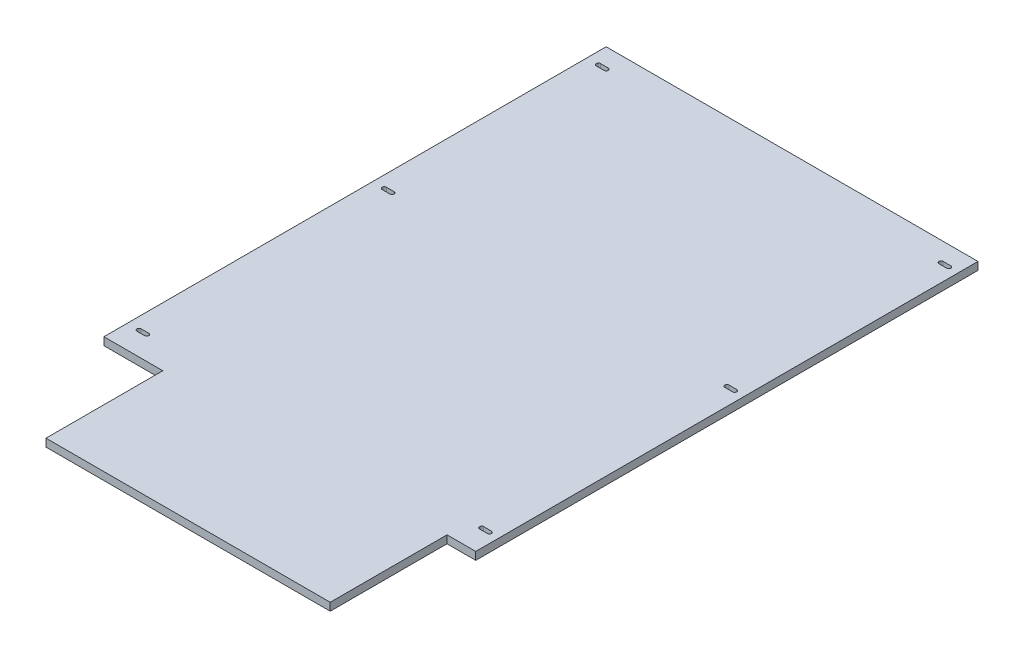
ISO-10303-21;
HEADER;
FILE_DESCRIPTION(('STEP AP214'),'2;1');
FILE_NAME('part.step','',(''),(''),'','','');
FILE_SCHEMA(('AUTOMOTIVE_DESIGN { 1 0 10303 214 1 1 1 1 }'));
ENDSEC;
DATA;
#1=APPLICATION_CONTEXT('core data for automotive mechanical design processes');
#2=APPLICATION_PROTOCOL_DEFINITION('international standard','automotive_design',2000,#1);
#3=PRODUCT_CONTEXT('',#1,'mechanical');
#4=PRODUCT('Part','Part','',(#3));
#5=PRODUCT_RELATED_PRODUCT_CATEGORY('part','',(#4));
#6=PRODUCT_DEFINITION_FORMATION('','',#4);
#7=PRODUCT_DEFINITION_CONTEXT('part definition',#1,'design');
#8=PRODUCT_DEFINITION('design','',#6,#7);
#9=PRODUCT_DEFINITION_SHAPE('','',#8);
#10=(LENGTH_UNIT() NAMED_UNIT(*) SI_UNIT(.MILLI.,.METRE.));
#11=(NAMED_UNIT(*) PLANE_ANGLE_UNIT() SI_UNIT($,.RADIAN.));
#12=(NAMED_UNIT(*) SI_UNIT($,.STERADIAN.) SOLID_ANGLE_UNIT());
#13=UNCERTAINTY_MEASURE_WITH_UNIT(LENGTH_MEASURE(1.E-05),#10,'distance_accuracy_value','');
#14=(GEOMETRIC_REPRESENTATION_CONTEXT(3) GLOBAL_UNCERTAINTY_ASSIGNED_CONTEXT((#13)) GLOBAL_UNIT_ASSIGNED_CONTEXT((#10,
#11,#12)) REPRESENTATION_CONTEXT('',''));
#15=CARTESIAN_POINT('',(0.,0.,0.));
#16=DIRECTION('',(0.,0.,1.));
#17=DIRECTION('',(1.,0.,0.));
#18=AXIS2_PLACEMENT_3D('',#15,#16,#17);
#19=CARTESIAN_POINT('',(0.,12.7,0.));
#20=DIRECTION('',(0.,1.,0.));
#21=DIRECTION('',(0.,0.,1.));
#22=AXIS2_PLACEMENT_3D('',#19,#20,#21);
#23=PLANE('',#22);
#24=DIRECTION('',(0.,0.,1.));
#25=VECTOR('',#24,1.);
#26=CARTESIAN_POINT('',(0.,12.7,-819.15));
#27=LINE('',#26,#25);
#28=CARTESIAN_POINT('',(0.,12.7,-819.15));
#29=VERTEX_POINT('',#28);
#30=CARTESIAN_POINT('',(0.,12.7,0.));
#31=VERTEX_POINT('',#30);
#32=EDGE_CURVE('E433',#29,#31,#27,.T.);
#33=ORIENTED_EDGE('',*,*,#32,.T.);
#34=DIRECTION('',(1.,0.,0.));
#35=VECTOR('',#34,1.);
#36=CARTESIAN_POINT('',(0.,12.7,0.));
#37=LINE('',#36,#35);
#38=CARTESIAN_POINT('',(96.04375,12.7,0.));
#39=VERTEX_POINT('',#38);
#40=EDGE_CURVE('E436',#31,#39,#37,.T.);
#41=ORIENTED_EDGE('',*,*,#40,.T.);
#42=DIRECTION('',(0.,0.,1.));
#43=VECTOR('',#42,1.);
#44=CARTESIAN_POINT('',(96.04375,12.7,0.));
#45=LINE('',#44,#43);
#46=CARTESIAN_POINT('',(96.04375,12.7,190.5));
#47=VERTEX_POINT('',#46);
#48=EDGE_CURVE('E439',#39,#47,#45,.T.);
#49=ORIENTED_EDGE('',*,*,#48,.T.);
#50=DIRECTION('',(1.,0.,0.));
#51=VECTOR('',#50,1.);
#52=CARTESIAN_POINT('',(96.04375,12.7,190.5));
#53=LINE('',#52,#51);
#54=CARTESIAN_POINT('',(559.59375,12.7,190.5));
#55=VERTEX_POINT('',#54);
#56=EDGE_CURVE('E441',#47,#55,#53,.T.);
#57=ORIENTED_EDGE('',*,*,#56,.T.);
#58=DIRECTION('',(0.,0.,-1.));
#59=VECTOR('',#58,1.);
#60=CARTESIAN_POINT('',(559.59375,12.7,190.5));
#61=LINE('',#60,#59);
#62=CARTESIAN_POINT('',(559.59375,12.7,0.));
#63=VERTEX_POINT('',#62);
#64=EDGE_CURVE('E443',#55,#63,#61,.T.);
#65=ORIENTED_EDGE('',*,*,#64,.T.);
#66=DIRECTION('',(1.,0.,0.));
#67=VECTOR('',#66,1.);
#68=CARTESIAN_POINT('',(559.59375,12.7,0.));
#69=LINE('',#68,#67);
#70=CARTESIAN_POINT('',(606.425,12.7,0.));
#71=VERTEX_POINT('',#70);
#72=EDGE_CURVE('E445',#63,#71,#69,.T.);
#73=ORIENTED_EDGE('',*,*,#72,.T.);
#74=DIRECTION('',(0.,0.,-1.));
#75=VECTOR('',#74,1.);
#76=CARTESIAN_POINT('',(606.425,12.7,0.));
#77=LINE('',#76,#75);
#78=CARTESIAN_POINT('',(606.425,12.7,-819.15));
#79=VERTEX_POINT('',#78);
#80=EDGE_CURVE('E447',#71,#79,#77,.T.);
#81=ORIENTED_EDGE('',*,*,#80,.T.);
#82=DIRECTION('',(-1.,0.,0.));
#83=VECTOR('',#82,1.);
#84=CARTESIAN_POINT('',(606.425,12.7,-819.15));
#85=LINE('',#84,#83);
#86=EDGE_CURVE('E449',#79,#29,#85,.T.);
#87=ORIENTED_EDGE('',*,*,#86,.T.);
#88=EDGE_LOOP('',(#33,#41,#49,#57,#65,#73,#81,#87));
#89=FACE_BOUND('',#88,.T.);
#90=DIRECTION('',(1.,0.,0.));
#91=VECTOR('',#90,1.);
#92=CARTESIAN_POINT('',(19.0500000000001,12.7,-34.7218));
#93=LINE('',#92,#91);
#94=CARTESIAN_POINT('',(19.0500000000001,12.7,-34.7218));
#95=VERTEX_POINT('',#94);
#96=CARTESIAN_POINT('',(31.7500000000001,12.7,-34.7218));
#97=VERTEX_POINT('',#96);
#98=EDGE_CURVE('E404',#95,#97,#93,.T.);
#99=ORIENTED_EDGE('',*,*,#98,.F.);
#100=CARTESIAN_POINT('',(19.0500000000001,12.7,-38.1));
#101=DIRECTION('',(0.,1.,0.));
#102=DIRECTION('',(0.,0.,1.));
#103=AXIS2_PLACEMENT_3D('',#100,#101,#102);
#104=CIRCLE('',#103,3.37819999999999);
#105=CARTESIAN_POINT('',(19.0500000000001,12.7,-41.4782));
#106=VERTEX_POINT('',#105);
#107=EDGE_CURVE('E402',#106,#95,#104,.T.);
#108=ORIENTED_EDGE('',*,*,#107,.F.);
#109=DIRECTION('',(-1.,0.,0.));
#110=VECTOR('',#109,1.);
#111=CARTESIAN_POINT('',(19.0500000000001,12.7,-41.4782));
#112=LINE('',#111,#110);
#113=CARTESIAN_POINT('',(31.7500000000001,12.7,-41.4782));
#114=VERTEX_POINT('',#113);
#115=EDGE_CURVE('E410',#114,#106,#112,.T.);
#116=ORIENTED_EDGE('',*,*,#115,.F.);
#117=CARTESIAN_POINT('',(31.7500000000001,12.7,-38.1));
#118=DIRECTION('',(0.,1.,0.));
#119=DIRECTION('',(0.,0.,1.));
#120=AXIS2_PLACEMENT_3D('',#117,#118,#119);
#121=CIRCLE('',#120,3.37819999999999);
#122=EDGE_CURVE('E407',#97,#114,#121,.T.);
#123=ORIENTED_EDGE('',*,*,#122,.F.);
#124=EDGE_LOOP('',(#99,#108,#116,#123));
#125=FACE_BOUND('',#124,.T.);
#126=DIRECTION('',(1.,0.,0.));
#127=VECTOR('',#126,1.);
#128=CARTESIAN_POINT('',(19.0500000000001,12.7,-434.7718));
#129=LINE('',#128,#127);
#130=CARTESIAN_POINT('',(19.0500000000001,12.7,-434.7718));
#131=VERTEX_POINT('',#130);
#132=CARTESIAN_POINT('',(31.7500000000001,12.7,-434.7718));
#133=VERTEX_POINT('',#132);
#134=EDGE_CURVE('E373',#131,#133,#129,.T.);
#135=ORIENTED_EDGE('',*,*,#134,.F.);
#136=CARTESIAN_POINT('',(19.0500000000001,12.7,-438.15));
#137=DIRECTION('',(0.,1.,0.));
#138=DIRECTION('',(0.,0.,1.));
#139=AXIS2_PLACEMENT_3D('',#136,#137,#138);
#140=CIRCLE('',#139,3.37820000000016);
#141=CARTESIAN_POINT('',(19.0500000000001,12.7,-441.5282));
#142=VERTEX_POINT('',#141);
#143=EDGE_CURVE('E371',#142,#131,#140,.T.);
#144=ORIENTED_EDGE('',*,*,#143,.F.);
#145=DIRECTION('',(-1.,0.,0.));
#146=VECTOR('',#145,1.);
#147=CARTESIAN_POINT('',(19.0500000000001,12.7,-441.5282));
#148=LINE('',#147,#146);
#149=CARTESIAN_POINT('',(31.7500000000001,12.7,-441.5282));
#150=VERTEX_POINT('',#149);
#151=EDGE_CURVE('E379',#150,#142,#148,.T.);
#152=ORIENTED_EDGE('',*,*,#151,.F.);
#153=CARTESIAN_POINT('',(31.7500000000001,12.7,-438.15));
#154=DIRECTION('',(0.,1.,0.));
#155=DIRECTION('',(0.,0.,1.));
#156=AXIS2_PLACEMENT_3D('',#153,#154,#155);
#157=CIRCLE('',#156,3.37820000000016);
#158=EDGE_CURVE('E376',#133,#150,#157,.T.);
#159=ORIENTED_EDGE('',*,*,#158,.F.);
#160=EDGE_LOOP('',(#135,#144,#152,#159));
#161=FACE_BOUND('',#160,.T.);
#162=DIRECTION('',(-1.,0.,0.));
#163=VECTOR('',#162,1.);
#164=CARTESIAN_POINT('',(31.7500000000001,12.7,-790.7782));
#165=LINE('',#164,#163);
#166=CARTESIAN_POINT('',(31.7500000000001,12.7,-790.7782));
#167=VERTEX_POINT('',#166);
#168=CARTESIAN_POINT('',(19.0500000000001,12.7,-790.7782));
#169=VERTEX_POINT('',#168);
#170=EDGE_CURVE('E342',#167,#169,#165,.T.);
#171=ORIENTED_EDGE('',*,*,#170,.F.);
#172=CARTESIAN_POINT('',(31.7500000000001,12.7,-787.4));
#173=DIRECTION('',(0.,1.,0.));
#174=DIRECTION('',(0.,0.,1.));
#175=AXIS2_PLACEMENT_3D('',#172,#173,#174);
#176=CIRCLE('',#175,3.3782);
#177=CARTESIAN_POINT('',(31.75,12.7,-784.0218));
#178=VERTEX_POINT('',#177);
#179=EDGE_CURVE('E340',#178,#167,#176,.T.);
#180=ORIENTED_EDGE('',*,*,#179,.F.);
#181=DIRECTION('',(1.,0.,0.));
#182=VECTOR('',#181,1.);
#183=CARTESIAN_POINT('',(31.75,12.7,-784.0218));
#184=LINE('',#183,#182);
#185=CARTESIAN_POINT('',(19.0500000000001,12.7,-784.0218));
#186=VERTEX_POINT('',#185);
#187=EDGE_CURVE('E348',#186,#178,#184,.T.);
#188=ORIENTED_EDGE('',*,*,#187,.F.);
#189=CARTESIAN_POINT('',(19.0500000000001,12.7,-787.4));
#190=DIRECTION('',(0.,1.,0.));
#191=DIRECTION('',(0.,0.,1.));
#192=AXIS2_PLACEMENT_3D('',#189,#190,#191);
#193=CIRCLE('',#192,3.3782);
#194=EDGE_CURVE('E345',#169,#186,#193,.T.);
#195=ORIENTED_EDGE('',*,*,#194,.F.);
#196=EDGE_LOOP('',(#171,#180,#188,#195));
#197=FACE_BOUND('',#196,.T.);
#198=DIRECTION('',(1.,0.,0.));
#199=VECTOR('',#198,1.);
#200=CARTESIAN_POINT('',(577.85,12.7,-784.0218));
#201=LINE('',#200,#199);
#202=CARTESIAN_POINT('',(577.85,12.7,-784.0218));
#203=VERTEX_POINT('',#202);
#204=CARTESIAN_POINT('',(590.55,12.7,-784.0218));
#205=VERTEX_POINT('',#204);
#206=EDGE_CURVE('E311',#203,#205,#201,.T.);
#207=ORIENTED_EDGE('',*,*,#206,.F.);
#208=CARTESIAN_POINT('',(577.85,12.7,-787.4));
#209=DIRECTION('',(0.,1.,0.));
#210=DIRECTION('',(0.,0.,-1.));
#211=AXIS2_PLACEMENT_3D('',#208,#209,#210);
#212=CIRCLE('',#211,3.3782);
#213=CARTESIAN_POINT('',(577.85,12.7,-790.7782));
#214=VERTEX_POINT('',#213);
#215=EDGE_CURVE('E309',#214,#203,#212,.T.);
#216=ORIENTED_EDGE('',*,*,#215,.F.);
#217=DIRECTION('',(-1.,0.,0.));
#218=VECTOR('',#217,1.);
#219=CARTESIAN_POINT('',(577.85,12.7,-790.7782));
#220=LINE('',#219,#218);
#221=CARTESIAN_POINT('',(590.55,12.7,-790.7782));
#222=VERTEX_POINT('',#221);
#223=EDGE_CURVE('E317',#222,#214,#220,.T.);
#224=ORIENTED_EDGE('',*,*,#223,.F.);
#225=CARTESIAN_POINT('',(590.55,12.7,-787.4));
#226=DIRECTION('',(0.,1.,0.));
#227=DIRECTION('',(0.,0.,-1.));
#228=AXIS2_PLACEMENT_3D('',#225,#226,#227);
#229=CIRCLE('',#228,3.3782);
#230=EDGE_CURVE('E314',#205,#222,#229,.T.);
#231=ORIENTED_EDGE('',*,*,#230,.F.);
#232=EDGE_LOOP('',(#207,#216,#224,#231));
#233=FACE_BOUND('',#232,.T.);
#234=DIRECTION('',(-1.,0.,0.));
#235=VECTOR('',#234,1.);
#236=CARTESIAN_POINT('',(590.55,12.7,-441.5282));
#237=LINE('',#236,#235);
#238=CARTESIAN_POINT('',(590.55,12.7,-441.5282));
#239=VERTEX_POINT('',#238);
#240=CARTESIAN_POINT('',(577.85,12.7,-441.5282));
#241=VERTEX_POINT('',#240);
#242=EDGE_CURVE('E280',#239,#241,#237,.T.);
#243=ORIENTED_EDGE('',*,*,#242,.F.);
#244=CARTESIAN_POINT('',(590.55,12.7,-438.15));
#245=DIRECTION('',(0.,1.,0.));
#246=DIRECTION('',(0.,0.,-1.));
#247=AXIS2_PLACEMENT_3D('',#244,#245,#246);
#248=CIRCLE('',#247,3.3782);
#249=CARTESIAN_POINT('',(590.55,12.7,-434.7718));
#250=VERTEX_POINT('',#249);
#251=EDGE_CURVE('E278',#250,#239,#248,.T.);
#252=ORIENTED_EDGE('',*,*,#251,.F.);
#253=DIRECTION('',(1.,0.,0.));
#254=VECTOR('',#253,1.);
#255=CARTESIAN_POINT('',(590.55,12.7,-434.7718));
#256=LINE('',#255,#254);
#257=CARTESIAN_POINT('',(577.85,12.7,-434.7718));
#258=VERTEX_POINT('',#257);
#259=EDGE_CURVE('E286',#258,#250,#256,.T.);
#260=ORIENTED_EDGE('',*,*,#259,.F.);
#261=CARTESIAN_POINT('',(577.85,12.7,-438.15));
#262=DIRECTION('',(0.,1.,0.));
#263=DIRECTION('',(0.,0.,-1.));
#264=AXIS2_PLACEMENT_3D('',#261,#262,#263);
#265=CIRCLE('',#264,3.3782);
#266=EDGE_CURVE('E283',#241,#258,#265,.T.);
#267=ORIENTED_EDGE('',*,*,#266,.F.);
#268=EDGE_LOOP('',(#243,#252,#260,#267));
#269=FACE_BOUND('',#268,.T.);
#270=DIRECTION('',(-1.,0.,0.));
#271=VECTOR('',#270,1.);
#272=CARTESIAN_POINT('',(590.55,12.7,-41.4782));
#273=LINE('',#272,#271);
#274=CARTESIAN_POINT('',(590.55,12.7,-41.4782));
#275=VERTEX_POINT('',#274);
#276=CARTESIAN_POINT('',(577.85,12.7,-41.4782));
#277=VERTEX_POINT('',#276);
#278=EDGE_CURVE('E250',#275,#277,#273,.T.);
#279=ORIENTED_EDGE('',*,*,#278,.F.);
#280=CARTESIAN_POINT('',(590.55,12.7,-38.1));
#281=DIRECTION('',(0.,1.,0.));
#282=DIRECTION('',(0.,0.,-1.));
#283=AXIS2_PLACEMENT_3D('',#280,#281,#282);
#284=CIRCLE('',#283,3.37820000000002);
#285=CARTESIAN_POINT('',(590.55,12.7,-34.7218));
#286=VERTEX_POINT('',#285);
#287=EDGE_CURVE('E242',#286,#275,#284,.T.);
#288=ORIENTED_EDGE('',*,*,#287,.F.);
#289=DIRECTION('',(1.,0.,0.));
#290=VECTOR('',#289,1.);
#291=CARTESIAN_POINT('',(590.55,12.7,-34.7218));
#292=LINE('',#291,#290);
#293=CARTESIAN_POINT('',(577.85,12.7,-34.7218));
#294=VERTEX_POINT('',#293);
#295=EDGE_CURVE('E264',#294,#286,#292,.T.);
#296=ORIENTED_EDGE('',*,*,#295,.F.);
#297=CARTESIAN_POINT('',(577.85,12.7,-38.1));
#298=DIRECTION('',(0.,1.,0.));
#299=DIRECTION('',(0.,0.,-1.));
#300=AXIS2_PLACEMENT_3D('',#297,#298,#299);
#301=CIRCLE('',#300,3.37820000000002);
#302=EDGE_CURVE('E262',#277,#294,#301,.T.);
#303=ORIENTED_EDGE('',*,*,#302,.F.);
#304=EDGE_LOOP('',(#279,#288,#296,#303));
#305=FACE_BOUND('',#304,.T.);
#306=ADVANCED_FACE('F33',(#89,#125,#161,#197,#233,#269,#305),#23,.T.);
#307=CARTESIAN_POINT('',(0.,0.,0.));
#308=DIRECTION('',(0.,1.,0.));
#309=DIRECTION('',(0.,0.,1.));
#310=AXIS2_PLACEMENT_3D('',#307,#308,#309);
#311=PLANE('',#310);
#312=CARTESIAN_POINT('',(590.55,0.,-438.15));
#313=DIRECTION('',(0.,1.,0.));
#314=DIRECTION('',(0.,0.,-1.));
#315=AXIS2_PLACEMENT_3D('',#312,#313,#314);
#316=CIRCLE('',#315,3.3782);
#317=CARTESIAN_POINT('',(590.55,0.,-434.7718));
#318=VERTEX_POINT('',#317);
#319=CARTESIAN_POINT('',(590.55,0.,-441.5282));
#320=VERTEX_POINT('',#319);
#321=EDGE_CURVE('E258',#318,#320,#316,.T.);
#322=ORIENTED_EDGE('',*,*,#321,.T.);
#323=DIRECTION('',(-1.,0.,0.));
#324=VECTOR('',#323,1.);
#325=CARTESIAN_POINT('',(590.55,0.,-441.5282));
#326=LINE('',#325,#324);
#327=CARTESIAN_POINT('',(577.85,0.,-441.5282));
#328=VERTEX_POINT('',#327);
#329=EDGE_CURVE('E291',#320,#328,#326,.T.);
#330=ORIENTED_EDGE('',*,*,#329,.T.);
#331=CARTESIAN_POINT('',(577.85,0.,-438.15));
#332=DIRECTION('',(0.,1.,0.));
#333=DIRECTION('',(0.,0.,-1.));
#334=AXIS2_PLACEMENT_3D('',#331,#332,#333);
#335=CIRCLE('',#334,3.3782);
#336=CARTESIAN_POINT('',(577.85,0.,-434.7718));
#337=VERTEX_POINT('',#336);
#338=EDGE_CURVE('E294',#328,#337,#335,.T.);
#339=ORIENTED_EDGE('',*,*,#338,.T.);
#340=DIRECTION('',(1.,0.,0.));
#341=VECTOR('',#340,1.);
#342=CARTESIAN_POINT('',(590.55,0.,-434.7718));
#343=LINE('',#342,#341);
#344=EDGE_CURVE('E281',#337,#318,#343,.T.);
#345=ORIENTED_EDGE('',*,*,#344,.T.);
#346=EDGE_LOOP('',(#322,#330,#339,#345));
#347=FACE_BOUND('',#346,.T.);
#348=CARTESIAN_POINT('',(31.7500000000001,0.,-787.4));
#349=DIRECTION('',(0.,1.,0.));
#350=DIRECTION('',(0.,0.,1.));
#351=AXIS2_PLACEMENT_3D('',#348,#349,#350);
#352=CIRCLE('',#351,3.3782);
#353=CARTESIAN_POINT('',(31.75,0.,-784.0218));
#354=VERTEX_POINT('',#353);
#355=CARTESIAN_POINT('',(31.7500000000001,0.,-790.7782));
#356=VERTEX_POINT('',#355);
#357=EDGE_CURVE('E339',#354,#356,#352,.T.);
#358=ORIENTED_EDGE('',*,*,#357,.T.);
#359=DIRECTION('',(-1.,0.,0.));
#360=VECTOR('',#359,1.);
#361=CARTESIAN_POINT('',(31.7500000000001,0.,-790.7782));
#362=LINE('',#361,#360);
#363=CARTESIAN_POINT('',(19.0500000000001,0.,-790.7782));
#364=VERTEX_POINT('',#363);
#365=EDGE_CURVE('E353',#356,#364,#362,.T.);
#366=ORIENTED_EDGE('',*,*,#365,.T.);
#367=CARTESIAN_POINT('',(19.0500000000001,0.,-787.4));
#368=DIRECTION('',(0.,1.,0.));
#369=DIRECTION('',(0.,0.,1.));
#370=AXIS2_PLACEMENT_3D('',#367,#368,#369);
#371=CIRCLE('',#370,3.3782);
#372=CARTESIAN_POINT('',(19.0500000000001,0.,-784.0218));
#373=VERTEX_POINT('',#372);
#374=EDGE_CURVE('E356',#364,#373,#371,.T.);
#375=ORIENTED_EDGE('',*,*,#374,.T.);
#376=DIRECTION('',(1.,0.,0.));
#377=VECTOR('',#376,1.);
#378=CARTESIAN_POINT('',(31.75,0.,-784.0218));
#379=LINE('',#378,#377);
#380=EDGE_CURVE('E343',#373,#354,#379,.T.);
#381=ORIENTED_EDGE('',*,*,#380,.T.);
#382=EDGE_LOOP('',(#358,#366,#375,#381));
#383=FACE_BOUND('',#382,.T.);
#384=CARTESIAN_POINT('',(19.0500000000001,0.,-38.1));
#385=DIRECTION('',(0.,1.,0.));
#386=DIRECTION('',(0.,0.,1.));
#387=AXIS2_PLACEMENT_3D('',#384,#385,#386);
#388=CIRCLE('',#387,3.37819999999999);
#389=CARTESIAN_POINT('',(19.0500000000001,0.,-41.4782));
#390=VERTEX_POINT('',#389);
#391=CARTESIAN_POINT('',(19.0500000000001,0.,-34.7218));
#392=VERTEX_POINT('',#391);
#393=EDGE_CURVE('E401',#390,#392,#388,.T.);
#394=ORIENTED_EDGE('',*,*,#393,.T.);
#395=DIRECTION('',(1.,0.,0.));
#396=VECTOR('',#395,1.);
#397=CARTESIAN_POINT('',(19.0500000000001,0.,-34.7218));
#398=LINE('',#397,#396);
#399=CARTESIAN_POINT('',(31.7500000000001,0.,-34.7218));
#400=VERTEX_POINT('',#399);
#401=EDGE_CURVE('E415',#392,#400,#398,.T.);
#402=ORIENTED_EDGE('',*,*,#401,.T.);
#403=CARTESIAN_POINT('',(31.7500000000001,0.,-38.1));
#404=DIRECTION('',(0.,1.,0.));
#405=DIRECTION('',(0.,0.,1.));
#406=AXIS2_PLACEMENT_3D('',#403,#404,#405);
#407=CIRCLE('',#406,3.37819999999999);
#408=CARTESIAN_POINT('',(31.7500000000001,0.,-41.4782));
#409=VERTEX_POINT('',#408);
#410=EDGE_CURVE('E418',#400,#409,#407,.T.);
#411=ORIENTED_EDGE('',*,*,#410,.T.);
#412=DIRECTION('',(-1.,0.,0.));
#413=VECTOR('',#412,1.);
#414=CARTESIAN_POINT('',(19.0500000000001,0.,-41.4782));
#415=LINE('',#414,#413);
#416=EDGE_CURVE('E405',#409,#390,#415,.T.);
#417=ORIENTED_EDGE('',*,*,#416,.T.);
#418=EDGE_LOOP('',(#394,#402,#411,#417));
#419=FACE_BOUND('',#418,.T.);
#420=DIRECTION('',(0.,0.,1.));
#421=VECTOR('',#420,1.);
#422=CARTESIAN_POINT('',(0.,0.,-819.15));
#423=LINE('',#422,#421);
#424=CARTESIAN_POINT('',(0.,0.,-819.15));
#425=VERTEX_POINT('',#424);
#426=CARTESIAN_POINT('',(0.,0.,0.));
#427=VERTEX_POINT('',#426);
#428=EDGE_CURVE('E432',#425,#427,#423,.T.);
#429=ORIENTED_EDGE('',*,*,#428,.F.);
#430=DIRECTION('',(-1.,0.,0.));
#431=VECTOR('',#430,1.);
#432=CARTESIAN_POINT('',(606.425,0.,-819.15));
#433=LINE('',#432,#431);
#434=CARTESIAN_POINT('',(606.425,0.,-819.15));
#435=VERTEX_POINT('',#434);
#436=EDGE_CURVE('E437',#435,#425,#433,.T.);
#437=ORIENTED_EDGE('',*,*,#436,.F.);
#438=DIRECTION('',(0.,0.,-1.));
#439=VECTOR('',#438,1.);
#440=CARTESIAN_POINT('',(606.425,0.,0.));
#441=LINE('',#440,#439);
#442=CARTESIAN_POINT('',(606.425,0.,0.));
#443=VERTEX_POINT('',#442);
#444=EDGE_CURVE('E464',#443,#435,#441,.T.);
#445=ORIENTED_EDGE('',*,*,#444,.F.);
#446=DIRECTION('',(1.,0.,0.));
#447=VECTOR('',#446,1.);
#448=CARTESIAN_POINT('',(559.59375,0.,0.));
#449=LINE('',#448,#447);
#450=CARTESIAN_POINT('',(559.59375,0.,0.));
#451=VERTEX_POINT('',#450);
#452=EDGE_CURVE('E462',#451,#443,#449,.T.);
#453=ORIENTED_EDGE('',*,*,#452,.F.);
#454=DIRECTION('',(0.,0.,-1.));
#455=VECTOR('',#454,1.);
#456=CARTESIAN_POINT('',(559.59375,0.,190.5));
#457=LINE('',#456,#455);
#458=CARTESIAN_POINT('',(559.59375,0.,190.5));
#459=VERTEX_POINT('',#458);
#460=EDGE_CURVE('E460',#459,#451,#457,.T.);
#461=ORIENTED_EDGE('',*,*,#460,.F.);
#462=DIRECTION('',(1.,0.,0.));
#463=VECTOR('',#462,1.);
#464=CARTESIAN_POINT('',(96.04375,0.,190.5));
#465=LINE('',#464,#463);
#466=CARTESIAN_POINT('',(96.04375,0.,190.5));
#467=VERTEX_POINT('',#466);
#468=EDGE_CURVE('E458',#467,#459,#465,.T.);
#469=ORIENTED_EDGE('',*,*,#468,.F.);
#470=DIRECTION('',(0.,0.,1.));
#471=VECTOR('',#470,1.);
#472=CARTESIAN_POINT('',(96.04375,0.,0.));
#473=LINE('',#472,#471);
#474=CARTESIAN_POINT('',(96.04375,0.,0.));
#475=VERTEX_POINT('',#474);
#476=EDGE_CURVE('E456',#475,#467,#473,.T.);
#477=ORIENTED_EDGE('',*,*,#476,.F.);
#478=DIRECTION('',(1.,0.,0.));
#479=VECTOR('',#478,1.);
#480=CARTESIAN_POINT('',(0.,0.,0.));
#481=LINE('',#480,#479);
#482=EDGE_CURVE('E454',#427,#475,#481,.T.);
#483=ORIENTED_EDGE('',*,*,#482,.F.);
#484=EDGE_LOOP('',(#429,#437,#445,#453,#461,#469,#477,#483));
#485=FACE_BOUND('',#484,.T.);
#486=CARTESIAN_POINT('',(19.0500000000001,0.,-438.15));
#487=DIRECTION('',(0.,1.,0.));
#488=DIRECTION('',(0.,0.,1.));
#489=AXIS2_PLACEMENT_3D('',#486,#487,#488);
#490=CIRCLE('',#489,3.37820000000016);
#491=CARTESIAN_POINT('',(19.0500000000001,0.,-441.5282));
#492=VERTEX_POINT('',#491);
#493=CARTESIAN_POINT('',(19.0500000000001,0.,-434.7718));
#494=VERTEX_POINT('',#493);
#495=EDGE_CURVE('E370',#492,#494,#490,.T.);
#496=ORIENTED_EDGE('',*,*,#495,.T.);
#497=DIRECTION('',(1.,0.,0.));
#498=VECTOR('',#497,1.);
#499=CARTESIAN_POINT('',(19.0500000000001,0.,-434.7718));
#500=LINE('',#499,#498);
#501=CARTESIAN_POINT('',(31.7500000000001,0.,-434.7718));
#502=VERTEX_POINT('',#501);
#503=EDGE_CURVE('E384',#494,#502,#500,.T.);
#504=ORIENTED_EDGE('',*,*,#503,.T.);
#505=CARTESIAN_POINT('',(31.7500000000001,0.,-438.15));
#506=DIRECTION('',(0.,1.,0.));
#507=DIRECTION('',(0.,0.,1.));
#508=AXIS2_PLACEMENT_3D('',#505,#506,#507);
#509=CIRCLE('',#508,3.37820000000016);
#510=CARTESIAN_POINT('',(31.7500000000001,0.,-441.5282));
#511=VERTEX_POINT('',#510);
#512=EDGE_CURVE('E387',#502,#511,#509,.T.);
#513=ORIENTED_EDGE('',*,*,#512,.T.);
#514=DIRECTION('',(-1.,0.,0.));
#515=VECTOR('',#514,1.);
#516=CARTESIAN_POINT('',(19.0500000000001,0.,-441.5282));
#517=LINE('',#516,#515);
#518=EDGE_CURVE('E374',#511,#492,#517,.T.);
#519=ORIENTED_EDGE('',*,*,#518,.T.);
#520=EDGE_LOOP('',(#496,#504,#513,#519));
#521=FACE_BOUND('',#520,.T.);
#522=CARTESIAN_POINT('',(577.85,0.,-787.4));
#523=DIRECTION('',(0.,1.,0.));
#524=DIRECTION('',(0.,0.,-1.));
#525=AXIS2_PLACEMENT_3D('',#522,#523,#524);
#526=CIRCLE('',#525,3.3782);
#527=CARTESIAN_POINT('',(577.85,0.,-790.7782));
#528=VERTEX_POINT('',#527);
#529=CARTESIAN_POINT('',(577.85,0.,-784.0218));
#530=VERTEX_POINT('',#529);
#531=EDGE_CURVE('E308',#528,#530,#526,.T.);
#532=ORIENTED_EDGE('',*,*,#531,.T.);
#533=DIRECTION('',(1.,0.,0.));
#534=VECTOR('',#533,1.);
#535=CARTESIAN_POINT('',(577.85,0.,-784.0218));
#536=LINE('',#535,#534);
#537=CARTESIAN_POINT('',(590.55,0.,-784.0218));
#538=VERTEX_POINT('',#537);
#539=EDGE_CURVE('E322',#530,#538,#536,.T.);
#540=ORIENTED_EDGE('',*,*,#539,.T.);
#541=CARTESIAN_POINT('',(590.55,0.,-787.4));
#542=DIRECTION('',(0.,1.,0.));
#543=DIRECTION('',(0.,0.,-1.));
#544=AXIS2_PLACEMENT_3D('',#541,#542,#543);
#545=CIRCLE('',#544,3.3782);
#546=CARTESIAN_POINT('',(590.55,0.,-790.7782));
#547=VERTEX_POINT('',#546);
#548=EDGE_CURVE('E325',#538,#547,#545,.T.);
#549=ORIENTED_EDGE('',*,*,#548,.T.);
#550=DIRECTION('',(-1.,0.,0.));
#551=VECTOR('',#550,1.);
#552=CARTESIAN_POINT('',(577.85,0.,-790.7782));
#553=LINE('',#552,#551);
#554=EDGE_CURVE('E312',#547,#528,#553,.T.);
#555=ORIENTED_EDGE('',*,*,#554,.T.);
#556=EDGE_LOOP('',(#532,#540,#549,#555));
#557=FACE_BOUND('',#556,.T.);
#558=CARTESIAN_POINT('',(590.55,0.,-38.1));
#559=DIRECTION('',(0.,1.,0.));
#560=DIRECTION('',(0.,0.,-1.));
#561=AXIS2_PLACEMENT_3D('',#558,#559,#560);
#562=CIRCLE('',#561,3.37820000000002);
#563=CARTESIAN_POINT('',(590.55,0.,-34.7218));
#564=VERTEX_POINT('',#563);
#565=CARTESIAN_POINT('',(590.55,0.,-41.4782));
#566=VERTEX_POINT('',#565);
#567=EDGE_CURVE('E56',#564,#566,#562,.T.);
#568=ORIENTED_EDGE('',*,*,#567,.T.);
#569=DIRECTION('',(-1.,0.,0.));
#570=VECTOR('',#569,1.);
#571=CARTESIAN_POINT('',(590.55,0.,-41.4782));
#572=LINE('',#571,#570);
#573=CARTESIAN_POINT('',(577.85,0.,-41.4782));
#574=VERTEX_POINT('',#573);
#575=EDGE_CURVE('E257',#566,#574,#572,.T.);
#576=ORIENTED_EDGE('',*,*,#575,.T.);
#577=CARTESIAN_POINT('',(577.85,0.,-38.1));
#578=DIRECTION('',(0.,1.,0.));
#579=DIRECTION('',(0.,0.,-1.));
#580=AXIS2_PLACEMENT_3D('',#577,#578,#579);
#581=CIRCLE('',#580,3.37820000000002);
#582=CARTESIAN_POINT('',(577.85,0.,-34.7218));
#583=VERTEX_POINT('',#582);
#584=EDGE_CURVE('E270',#574,#583,#581,.T.);
#585=ORIENTED_EDGE('',*,*,#584,.T.);
#586=DIRECTION('',(1.,0.,0.));
#587=VECTOR('',#586,1.);
#588=CARTESIAN_POINT('',(590.55,0.,-34.7218));
#589=LINE('',#588,#587);
#590=EDGE_CURVE('E251',#583,#564,#589,.T.);
#591=ORIENTED_EDGE('',*,*,#590,.T.);
#592=EDGE_LOOP('',(#568,#576,#585,#591));
#593=FACE_BOUND('',#592,.T.);
#594=ADVANCED_FACE('F494',(#347,#383,#419,#485,#521,#557,#593),#311,.F.);
#595=CARTESIAN_POINT('',(0.,12.7,-819.15));
#596=DIRECTION('',(1.,0.,0.));
#597=DIRECTION('',(0.,0.,-1.));
#598=AXIS2_PLACEMENT_3D('',#595,#596,#597);
#599=PLANE('',#598);
#600=ORIENTED_EDGE('',*,*,#428,.T.);
#601=DIRECTION('',(0.,-1.,0.));
#602=VECTOR('',#601,1.);
#603=CARTESIAN_POINT('',(0.,12.7,0.));
#604=LINE('',#603,#602);
#605=EDGE_CURVE('E11',#31,#427,#604,.T.);
#606=ORIENTED_EDGE('',*,*,#605,.F.);
#607=ORIENTED_EDGE('',*,*,#32,.F.);
#608=DIRECTION('',(0.,-1.,0.));
#609=VECTOR('',#608,1.);
#610=CARTESIAN_POINT('',(0.,12.7,-819.15));
#611=LINE('',#610,#609);
#612=EDGE_CURVE('E451',#29,#425,#611,.T.);
#613=ORIENTED_EDGE('',*,*,#612,.T.);
#614=EDGE_LOOP('',(#600,#606,#607,#613));
#615=FACE_BOUND('',#614,.T.);
#616=ADVANCED_FACE('F35',(#615),#599,.F.);
#617=CARTESIAN_POINT('',(0.,12.7,0.));
#618=DIRECTION('',(0.,0.,-1.));
#619=DIRECTION('',(-1.,0.,0.));
#620=AXIS2_PLACEMENT_3D('',#617,#618,#619);
#621=PLANE('',#620);
#622=ORIENTED_EDGE('',*,*,#482,.T.);
#623=DIRECTION('',(0.,-1.,0.));
#624=VECTOR('',#623,1.);
#625=CARTESIAN_POINT('',(96.04375,12.7,0.));
#626=LINE('',#625,#624);
#627=EDGE_CURVE('E41',#39,#475,#626,.T.);
#628=ORIENTED_EDGE('',*,*,#627,.F.);
#629=ORIENTED_EDGE('',*,*,#40,.F.);
#630=ORIENTED_EDGE('',*,*,#605,.T.);
#631=EDGE_LOOP('',(#622,#628,#629,#630));
#632=FACE_BOUND('',#631,.T.);
#633=ADVANCED_FACE('F512',(#632),#621,.F.);
#634=CARTESIAN_POINT('',(96.04375,12.7,0.));
#635=DIRECTION('',(1.,0.,0.));
#636=DIRECTION('',(0.,0.,-1.));
#637=AXIS2_PLACEMENT_3D('',#634,#635,#636);
#638=PLANE('',#637);
#639=ORIENTED_EDGE('',*,*,#476,.T.);
#640=DIRECTION('',(0.,-1.,0.));
#641=VECTOR('',#640,1.);
#642=CARTESIAN_POINT('',(96.04375,12.7,190.5));
#643=LINE('',#642,#641);
#644=EDGE_CURVE('E481',#47,#467,#643,.T.);
#645=ORIENTED_EDGE('',*,*,#644,.F.);
#646=ORIENTED_EDGE('',*,*,#48,.F.);
#647=ORIENTED_EDGE('',*,*,#627,.T.);
#648=EDGE_LOOP('',(#639,#645,#646,#647));
#649=FACE_BOUND('',#648,.T.);
#650=ADVANCED_FACE('F488',(#649),#638,.F.);
#651=CARTESIAN_POINT('',(96.04375,12.7,190.5));
#652=DIRECTION('',(0.,0.,-1.));
#653=DIRECTION('',(-1.,0.,0.));
#654=AXIS2_PLACEMENT_3D('',#651,#652,#653);
#655=PLANE('',#654);
#656=ORIENTED_EDGE('',*,*,#468,.T.);
#657=DIRECTION('',(0.,-1.,0.));
#658=VECTOR('',#657,1.);
#659=CARTESIAN_POINT('',(559.59375,12.7,190.5));
#660=LINE('',#659,#658);
#661=EDGE_CURVE('E478',#55,#459,#660,.T.);
#662=ORIENTED_EDGE('',*,*,#661,.F.);
#663=ORIENTED_EDGE('',*,*,#56,.F.);
#664=ORIENTED_EDGE('',*,*,#644,.T.);
#665=EDGE_LOOP('',(#656,#662,#663,#664));
#666=FACE_BOUND('',#665,.T.);
#667=ADVANCED_FACE('F500',(#666),#655,.F.);
#668=CARTESIAN_POINT('',(559.59375,12.7,190.5));
#669=DIRECTION('',(-1.,0.,0.));
#670=DIRECTION('',(0.,0.,1.));
#671=AXIS2_PLACEMENT_3D('',#668,#669,#670);
#672=PLANE('',#671);
#673=ORIENTED_EDGE('',*,*,#460,.T.);
#674=DIRECTION('',(0.,-1.,0.));
#675=VECTOR('',#674,1.);
#676=CARTESIAN_POINT('',(559.59375,12.7,0.));
#677=LINE('',#676,#675);
#678=EDGE_CURVE('E475',#63,#451,#677,.T.);
#679=ORIENTED_EDGE('',*,*,#678,.F.);
#680=ORIENTED_EDGE('',*,*,#64,.F.);
#681=ORIENTED_EDGE('',*,*,#661,.T.);
#682=EDGE_LOOP('',(#673,#679,#680,#681));
#683=FACE_BOUND('',#682,.T.);
#684=ADVANCED_FACE('F504',(#683),#672,.F.);
#685=CARTESIAN_POINT('',(559.59375,12.7,0.));
#686=DIRECTION('',(0.,0.,-1.));
#687=DIRECTION('',(-1.,0.,0.));
#688=AXIS2_PLACEMENT_3D('',#685,#686,#687);
#689=PLANE('',#688);
#690=ORIENTED_EDGE('',*,*,#452,.T.);
#691=DIRECTION('',(0.,-1.,0.));
#692=VECTOR('',#691,1.);
#693=CARTESIAN_POINT('',(606.425,12.7,0.));
#694=LINE('',#693,#692);
#695=EDGE_CURVE('E472',#71,#443,#694,.T.);
#696=ORIENTED_EDGE('',*,*,#695,.F.);
#697=ORIENTED_EDGE('',*,*,#72,.F.);
#698=ORIENTED_EDGE('',*,*,#678,.T.);
#699=EDGE_LOOP('',(#690,#696,#697,#698));
#700=FACE_BOUND('',#699,.T.);
#701=ADVANCED_FACE('F525',(#700),#689,.F.);
#702=CARTESIAN_POINT('',(606.425,12.7,0.));
#703=DIRECTION('',(-1.,0.,0.));
#704=DIRECTION('',(0.,0.,1.));
#705=AXIS2_PLACEMENT_3D('',#702,#703,#704);
#706=PLANE('',#705);
#707=ORIENTED_EDGE('',*,*,#444,.T.);
#708=DIRECTION('',(0.,-1.,0.));
#709=VECTOR('',#708,1.);
#710=CARTESIAN_POINT('',(606.425,12.7,-819.15));
#711=LINE('',#710,#709);
#712=EDGE_CURVE('E469',#79,#435,#711,.T.);
#713=ORIENTED_EDGE('',*,*,#712,.F.);
#714=ORIENTED_EDGE('',*,*,#80,.F.);
#715=ORIENTED_EDGE('',*,*,#695,.T.);
#716=EDGE_LOOP('',(#707,#713,#714,#715));
#717=FACE_BOUND('',#716,.T.);
#718=ADVANCED_FACE('F523',(#717),#706,.F.);
#719=CARTESIAN_POINT('',(606.425,12.7,-819.15));
#720=DIRECTION('',(0.,0.,1.));
#721=DIRECTION('',(1.,0.,0.));
#722=AXIS2_PLACEMENT_3D('',#719,#720,#721);
#723=PLANE('',#722);
#724=ORIENTED_EDGE('',*,*,#436,.T.);
#725=ORIENTED_EDGE('',*,*,#612,.F.);
#726=ORIENTED_EDGE('',*,*,#86,.F.);
#727=ORIENTED_EDGE('',*,*,#712,.T.);
#728=EDGE_LOOP('',(#724,#725,#726,#727));
#729=FACE_BOUND('',#728,.T.);
#730=ADVANCED_FACE('F518',(#729),#723,.F.);
#731=CARTESIAN_POINT('',(19.0500000000001,12.7,-38.1));
#732=DIRECTION('',(0.,-1.,0.));
#733=DIRECTION('',(0.,0.,-1.));
#734=AXIS2_PLACEMENT_3D('',#731,#732,#733);
#735=CYLINDRICAL_SURFACE('',#734,3.37819999999999);
#736=ORIENTED_EDGE('',*,*,#393,.F.);
#737=DIRECTION('',(0.,-1.,0.));
#738=VECTOR('',#737,1.);
#739=CARTESIAN_POINT('',(19.0500000000001,12.7,-41.4782));
#740=LINE('',#739,#738);
#741=EDGE_CURVE('E412',#106,#390,#740,.T.);
#742=ORIENTED_EDGE('',*,*,#741,.F.);
#743=ORIENTED_EDGE('',*,*,#107,.T.);
#744=DIRECTION('',(0.,-1.,0.));
#745=VECTOR('',#744,1.);
#746=CARTESIAN_POINT('',(19.0500000000001,12.7,-34.7218));
#747=LINE('',#746,#745);
#748=EDGE_CURVE('E429',#95,#392,#747,.T.);
#749=ORIENTED_EDGE('',*,*,#748,.T.);
#750=EDGE_LOOP('',(#736,#742,#743,#749));
#751=FACE_BOUND('',#750,.T.);
#752=ADVANCED_FACE('F542',(#751),#735,.F.);
#753=CARTESIAN_POINT('',(19.0500000000001,12.7,-34.7218));
#754=DIRECTION('',(0.,0.,-1.));
#755=DIRECTION('',(-1.,0.,0.));
#756=AXIS2_PLACEMENT_3D('',#753,#754,#755);
#757=PLANE('',#756);
#758=ORIENTED_EDGE('',*,*,#401,.F.);
#759=ORIENTED_EDGE('',*,*,#748,.F.);
#760=ORIENTED_EDGE('',*,*,#98,.T.);
#761=DIRECTION('',(0.,-1.,0.));
#762=VECTOR('',#761,1.);
#763=CARTESIAN_POINT('',(31.7500000000001,12.7,-34.7218));
#764=LINE('',#763,#762);
#765=EDGE_CURVE('E427',#97,#400,#764,.T.);
#766=ORIENTED_EDGE('',*,*,#765,.T.);
#767=EDGE_LOOP('',(#758,#759,#760,#766));
#768=FACE_BOUND('',#767,.T.);
#769=ADVANCED_FACE('F549',(#768),#757,.T.);
#770=CARTESIAN_POINT('',(31.7500000000001,12.7,-38.1));
#771=DIRECTION('',(0.,-1.,0.));
#772=DIRECTION('',(0.,0.,-1.));
#773=AXIS2_PLACEMENT_3D('',#770,#771,#772);
#774=CYLINDRICAL_SURFACE('',#773,3.37819999999999);
#775=ORIENTED_EDGE('',*,*,#410,.F.);
#776=ORIENTED_EDGE('',*,*,#765,.F.);
#777=ORIENTED_EDGE('',*,*,#122,.T.);
#778=DIRECTION('',(0.,-1.,0.));
#779=VECTOR('',#778,1.);
#780=CARTESIAN_POINT('',(31.7500000000001,12.7,-41.4782));
#781=LINE('',#780,#779);
#782=EDGE_CURVE('E425',#114,#409,#781,.T.);
#783=ORIENTED_EDGE('',*,*,#782,.T.);
#784=EDGE_LOOP('',(#775,#776,#777,#783));
#785=FACE_BOUND('',#784,.T.);
#786=ADVANCED_FACE('F554',(#785),#774,.F.);
#787=CARTESIAN_POINT('',(19.0500000000001,12.7,-41.4782));
#788=DIRECTION('',(0.,0.,1.));
#789=DIRECTION('',(1.,0.,0.));
#790=AXIS2_PLACEMENT_3D('',#787,#788,#789);
#791=PLANE('',#790);
#792=ORIENTED_EDGE('',*,*,#416,.F.);
#793=ORIENTED_EDGE('',*,*,#782,.F.);
#794=ORIENTED_EDGE('',*,*,#115,.T.);
#795=ORIENTED_EDGE('',*,*,#741,.T.);
#796=EDGE_LOOP('',(#792,#793,#794,#795));
#797=FACE_BOUND('',#796,.T.);
#798=ADVANCED_FACE('F562',(#797),#791,.T.);
#799=CARTESIAN_POINT('',(19.0500000000001,12.7,-438.15));
#800=DIRECTION('',(0.,-1.,0.));
#801=DIRECTION('',(0.,0.,-1.));
#802=AXIS2_PLACEMENT_3D('',#799,#800,#801);
#803=CYLINDRICAL_SURFACE('',#802,3.37820000000016);
#804=ORIENTED_EDGE('',*,*,#495,.F.);
#805=DIRECTION('',(0.,-1.,0.));
#806=VECTOR('',#805,1.);
#807=CARTESIAN_POINT('',(19.0500000000001,12.7,-441.5282));
#808=LINE('',#807,#806);
#809=EDGE_CURVE('E381',#142,#492,#808,.T.);
#810=ORIENTED_EDGE('',*,*,#809,.F.);
#811=ORIENTED_EDGE('',*,*,#143,.T.);
#812=DIRECTION('',(0.,-1.,0.));
#813=VECTOR('',#812,1.);
#814=CARTESIAN_POINT('',(19.0500000000001,12.7,-434.7718));
#815=LINE('',#814,#813);
#816=EDGE_CURVE('E398',#131,#494,#815,.T.);
#817=ORIENTED_EDGE('',*,*,#816,.T.);
#818=EDGE_LOOP('',(#804,#810,#811,#817));
#819=FACE_BOUND('',#818,.T.);
#820=ADVANCED_FACE('F657',(#819),#803,.F.);
#821=CARTESIAN_POINT('',(19.0500000000001,12.7,-434.7718));
#822=DIRECTION('',(0.,0.,-1.));
#823=DIRECTION('',(-1.,0.,0.));
#824=AXIS2_PLACEMENT_3D('',#821,#822,#823);
#825=PLANE('',#824);
#826=ORIENTED_EDGE('',*,*,#503,.F.);
#827=ORIENTED_EDGE('',*,*,#816,.F.);
#828=ORIENTED_EDGE('',*,*,#134,.T.);
#829=DIRECTION('',(0.,-1.,0.));
#830=VECTOR('',#829,1.);
#831=CARTESIAN_POINT('',(31.7500000000001,12.7,-434.7718));
#832=LINE('',#831,#830);
#833=EDGE_CURVE('E396',#133,#502,#832,.T.);
#834=ORIENTED_EDGE('',*,*,#833,.T.);
#835=EDGE_LOOP('',(#826,#827,#828,#834));
#836=FACE_BOUND('',#835,.T.);
#837=ADVANCED_FACE('F653',(#836),#825,.T.);
#838=CARTESIAN_POINT('',(31.7500000000001,12.7,-438.15));
#839=DIRECTION('',(0.,-1.,0.));
#840=DIRECTION('',(0.,0.,-1.));
#841=AXIS2_PLACEMENT_3D('',#838,#839,#840);
#842=CYLINDRICAL_SURFACE('',#841,3.37820000000016);
#843=ORIENTED_EDGE('',*,*,#512,.F.);
#844=ORIENTED_EDGE('',*,*,#833,.F.);
#845=ORIENTED_EDGE('',*,*,#158,.T.);
#846=DIRECTION('',(0.,-1.,0.));
#847=VECTOR('',#846,1.);
#848=CARTESIAN_POINT('',(31.7500000000001,12.7,-441.5282));
#849=LINE('',#848,#847);
#850=EDGE_CURVE('E394',#150,#511,#849,.T.);
#851=ORIENTED_EDGE('',*,*,#850,.T.);
#852=EDGE_LOOP('',(#843,#844,#845,#851));
#853=FACE_BOUND('',#852,.T.);
#854=ADVANCED_FACE('F649',(#853),#842,.F.);
#855=CARTESIAN_POINT('',(19.0500000000001,12.7,-441.5282));
#856=DIRECTION('',(0.,0.,1.));
#857=DIRECTION('',(1.,0.,0.));
#858=AXIS2_PLACEMENT_3D('',#855,#856,#857);
#859=PLANE('',#858);
#860=ORIENTED_EDGE('',*,*,#518,.F.);
#861=ORIENTED_EDGE('',*,*,#850,.F.);
#862=ORIENTED_EDGE('',*,*,#151,.T.);
#863=ORIENTED_EDGE('',*,*,#809,.T.);
#864=EDGE_LOOP('',(#860,#861,#862,#863));
#865=FACE_BOUND('',#864,.T.);
#866=ADVANCED_FACE('F645',(#865),#859,.T.);
#867=CARTESIAN_POINT('',(31.7500000000001,12.7,-787.4));
#868=DIRECTION('',(0.,-1.,0.));
#869=DIRECTION('',(0.,0.,-1.));
#870=AXIS2_PLACEMENT_3D('',#867,#868,#869);
#871=CYLINDRICAL_SURFACE('',#870,3.3782);
#872=ORIENTED_EDGE('',*,*,#357,.F.);
#873=DIRECTION('',(0.,-1.,0.));
#874=VECTOR('',#873,1.);
#875=CARTESIAN_POINT('',(31.75,12.7,-784.0218));
#876=LINE('',#875,#874);
#877=EDGE_CURVE('E350',#178,#354,#876,.T.);
#878=ORIENTED_EDGE('',*,*,#877,.F.);
#879=ORIENTED_EDGE('',*,*,#179,.T.);
#880=DIRECTION('',(0.,-1.,0.));
#881=VECTOR('',#880,1.);
#882=CARTESIAN_POINT('',(31.7500000000001,12.7,-790.7782));
#883=LINE('',#882,#881);
#884=EDGE_CURVE('E367',#167,#356,#883,.T.);
#885=ORIENTED_EDGE('',*,*,#884,.T.);
#886=EDGE_LOOP('',(#872,#878,#879,#885));
#887=FACE_BOUND('',#886,.T.);
#888=ADVANCED_FACE('F641',(#887),#871,.F.);
#889=CARTESIAN_POINT('',(31.7500000000001,12.7,-790.7782));
#890=DIRECTION('',(0.,0.,1.));
#891=DIRECTION('',(1.,0.,0.));
#892=AXIS2_PLACEMENT_3D('',#889,#890,#891);
#893=PLANE('',#892);
#894=ORIENTED_EDGE('',*,*,#365,.F.);
#895=ORIENTED_EDGE('',*,*,#884,.F.);
#896=ORIENTED_EDGE('',*,*,#170,.T.);
#897=DIRECTION('',(0.,-1.,0.));
#898=VECTOR('',#897,1.);
#899=CARTESIAN_POINT('',(19.0500000000001,12.7,-790.7782));
#900=LINE('',#899,#898);
#901=EDGE_CURVE('E365',#169,#364,#900,.T.);
#902=ORIENTED_EDGE('',*,*,#901,.T.);
#903=EDGE_LOOP('',(#894,#895,#896,#902));
#904=FACE_BOUND('',#903,.T.);
#905=ADVANCED_FACE('F637',(#904),#893,.T.);
#906=CARTESIAN_POINT('',(19.0500000000001,12.7,-787.4));
#907=DIRECTION('',(0.,-1.,0.));
#908=DIRECTION('',(0.,0.,-1.));
#909=AXIS2_PLACEMENT_3D('',#906,#907,#908);
#910=CYLINDRICAL_SURFACE('',#909,3.3782);
#911=ORIENTED_EDGE('',*,*,#374,.F.);
#912=ORIENTED_EDGE('',*,*,#901,.F.);
#913=ORIENTED_EDGE('',*,*,#194,.T.);
#914=DIRECTION('',(0.,-1.,0.));
#915=VECTOR('',#914,1.);
#916=CARTESIAN_POINT('',(19.0500000000001,12.7,-784.0218));
#917=LINE('',#916,#915);
#918=EDGE_CURVE('E363',#186,#373,#917,.T.);
#919=ORIENTED_EDGE('',*,*,#918,.T.);
#920=EDGE_LOOP('',(#911,#912,#913,#919));
#921=FACE_BOUND('',#920,.T.);
#922=ADVANCED_FACE('F633',(#921),#910,.F.);
#923=CARTESIAN_POINT('',(31.75,12.7,-784.0218));
#924=DIRECTION('',(0.,0.,-1.));
#925=DIRECTION('',(-1.,0.,0.));
#926=AXIS2_PLACEMENT_3D('',#923,#924,#925);
#927=PLANE('',#926);
#928=ORIENTED_EDGE('',*,*,#380,.F.);
#929=ORIENTED_EDGE('',*,*,#918,.F.);
#930=ORIENTED_EDGE('',*,*,#187,.T.);
#931=ORIENTED_EDGE('',*,*,#877,.T.);
#932=EDGE_LOOP('',(#928,#929,#930,#931));
#933=FACE_BOUND('',#932,.T.);
#934=ADVANCED_FACE('F629',(#933),#927,.T.);
#935=CARTESIAN_POINT('',(577.85,12.7,-787.4));
#936=DIRECTION('',(0.,-1.,0.));
#937=DIRECTION('',(0.,0.,-1.));
#938=AXIS2_PLACEMENT_3D('',#935,#936,#937);
#939=CYLINDRICAL_SURFACE('',#938,3.3782);
#940=ORIENTED_EDGE('',*,*,#531,.F.);
#941=DIRECTION('',(0.,-1.,0.));
#942=VECTOR('',#941,1.);
#943=CARTESIAN_POINT('',(577.85,12.7,-790.7782));
#944=LINE('',#943,#942);
#945=EDGE_CURVE('E319',#214,#528,#944,.T.);
#946=ORIENTED_EDGE('',*,*,#945,.F.);
#947=ORIENTED_EDGE('',*,*,#215,.T.);
#948=DIRECTION('',(0.,-1.,0.));
#949=VECTOR('',#948,1.);
#950=CARTESIAN_POINT('',(577.85,12.7,-784.0218));
#951=LINE('',#950,#949);
#952=EDGE_CURVE('E336',#203,#530,#951,.T.);
#953=ORIENTED_EDGE('',*,*,#952,.T.);
#954=EDGE_LOOP('',(#940,#946,#947,#953));
#955=FACE_BOUND('',#954,.T.);
#956=ADVANCED_FACE('F625',(#955),#939,.F.);
#957=CARTESIAN_POINT('',(577.85,12.7,-784.0218));
#958=DIRECTION('',(0.,0.,-1.));
#959=DIRECTION('',(-1.,0.,0.));
#960=AXIS2_PLACEMENT_3D('',#957,#958,#959);
#961=PLANE('',#960);
#962=ORIENTED_EDGE('',*,*,#539,.F.);
#963=ORIENTED_EDGE('',*,*,#952,.F.);
#964=ORIENTED_EDGE('',*,*,#206,.T.);
#965=DIRECTION('',(0.,-1.,0.));
#966=VECTOR('',#965,1.);
#967=CARTESIAN_POINT('',(590.55,12.7,-784.0218));
#968=LINE('',#967,#966);
#969=EDGE_CURVE('E334',#205,#538,#968,.T.);
#970=ORIENTED_EDGE('',*,*,#969,.T.);
#971=EDGE_LOOP('',(#962,#963,#964,#970));
#972=FACE_BOUND('',#971,.T.);
#973=ADVANCED_FACE('F621',(#972),#961,.T.);
#974=CARTESIAN_POINT('',(590.55,12.7,-787.4));
#975=DIRECTION('',(0.,-1.,0.));
#976=DIRECTION('',(0.,0.,-1.));
#977=AXIS2_PLACEMENT_3D('',#974,#975,#976);
#978=CYLINDRICAL_SURFACE('',#977,3.3782);
#979=ORIENTED_EDGE('',*,*,#548,.F.);
#980=ORIENTED_EDGE('',*,*,#969,.F.);
#981=ORIENTED_EDGE('',*,*,#230,.T.);
#982=DIRECTION('',(0.,-1.,0.));
#983=VECTOR('',#982,1.);
#984=CARTESIAN_POINT('',(590.55,12.7,-790.7782));
#985=LINE('',#984,#983);
#986=EDGE_CURVE('E332',#222,#547,#985,.T.);
#987=ORIENTED_EDGE('',*,*,#986,.T.);
#988=EDGE_LOOP('',(#979,#980,#981,#987));
#989=FACE_BOUND('',#988,.T.);
#990=ADVANCED_FACE('F617',(#989),#978,.F.);
#991=CARTESIAN_POINT('',(577.85,12.7,-790.7782));
#992=DIRECTION('',(0.,0.,1.));
#993=DIRECTION('',(1.,0.,0.));
#994=AXIS2_PLACEMENT_3D('',#991,#992,#993);
#995=PLANE('',#994);
#996=ORIENTED_EDGE('',*,*,#554,.F.);
#997=ORIENTED_EDGE('',*,*,#986,.F.);
#998=ORIENTED_EDGE('',*,*,#223,.T.);
#999=ORIENTED_EDGE('',*,*,#945,.T.);
#1000=EDGE_LOOP('',(#996,#997,#998,#999));
#1001=FACE_BOUND('',#1000,.T.);
#1002=ADVANCED_FACE('F614',(#1001),#995,.T.);
#1003=CARTESIAN_POINT('',(590.55,12.7,-438.15));
#1004=DIRECTION('',(0.,-1.,0.));
#1005=DIRECTION('',(0.,0.,-1.));
#1006=AXIS2_PLACEMENT_3D('',#1003,#1004,#1005);
#1007=CYLINDRICAL_SURFACE('',#1006,3.3782);
#1008=ORIENTED_EDGE('',*,*,#321,.F.);
#1009=DIRECTION('',(0.,-1.,0.));
#1010=VECTOR('',#1009,1.);
#1011=CARTESIAN_POINT('',(590.55,12.7,-434.7718));
#1012=LINE('',#1011,#1010);
#1013=EDGE_CURVE('E288',#250,#318,#1012,.T.);
#1014=ORIENTED_EDGE('',*,*,#1013,.F.);
#1015=ORIENTED_EDGE('',*,*,#251,.T.);
#1016=DIRECTION('',(0.,-1.,0.));
#1017=VECTOR('',#1016,1.);
#1018=CARTESIAN_POINT('',(590.55,12.7,-441.5282));
#1019=LINE('',#1018,#1017);
#1020=EDGE_CURVE('E305',#239,#320,#1019,.T.);
#1021=ORIENTED_EDGE('',*,*,#1020,.T.);
#1022=EDGE_LOOP('',(#1008,#1014,#1015,#1021));
#1023=FACE_BOUND('',#1022,.T.);
#1024=ADVANCED_FACE('F596',(#1023),#1007,.F.);
#1025=CARTESIAN_POINT('',(590.55,12.7,-441.5282));
#1026=DIRECTION('',(0.,0.,1.));
#1027=DIRECTION('',(1.,0.,0.));
#1028=AXIS2_PLACEMENT_3D('',#1025,#1026,#1027);
#1029=PLANE('',#1028);
#1030=ORIENTED_EDGE('',*,*,#329,.F.);
#1031=ORIENTED_EDGE('',*,*,#1020,.F.);
#1032=ORIENTED_EDGE('',*,*,#242,.T.);
#1033=DIRECTION('',(0.,-1.,0.));
#1034=VECTOR('',#1033,1.);
#1035=CARTESIAN_POINT('',(577.85,12.7,-441.5282));
#1036=LINE('',#1035,#1034);
#1037=EDGE_CURVE('E303',#241,#328,#1036,.T.);
#1038=ORIENTED_EDGE('',*,*,#1037,.T.);
#1039=EDGE_LOOP('',(#1030,#1031,#1032,#1038));
#1040=FACE_BOUND('',#1039,.T.);
#1041=ADVANCED_FACE('F589',(#1040),#1029,.T.);
#1042=CARTESIAN_POINT('',(577.85,12.7,-438.15));
#1043=DIRECTION('',(0.,-1.,0.));
#1044=DIRECTION('',(0.,0.,-1.));
#1045=AXIS2_PLACEMENT_3D('',#1042,#1043,#1044);
#1046=CYLINDRICAL_SURFACE('',#1045,3.3782);
#1047=ORIENTED_EDGE('',*,*,#338,.F.);
#1048=ORIENTED_EDGE('',*,*,#1037,.F.);
#1049=ORIENTED_EDGE('',*,*,#266,.T.);
#1050=DIRECTION('',(0.,-1.,0.));
#1051=VECTOR('',#1050,1.);
#1052=CARTESIAN_POINT('',(577.85,12.7,-434.7718));
#1053=LINE('',#1052,#1051);
#1054=EDGE_CURVE('E301',#258,#337,#1053,.T.);
#1055=ORIENTED_EDGE('',*,*,#1054,.T.);
#1056=EDGE_LOOP('',(#1047,#1048,#1049,#1055));
#1057=FACE_BOUND('',#1056,.T.);
#1058=ADVANCED_FACE('F592',(#1057),#1046,.F.);
#1059=CARTESIAN_POINT('',(590.55,12.7,-434.7718));
#1060=DIRECTION('',(0.,0.,-1.));
#1061=DIRECTION('',(-1.,0.,0.));
#1062=AXIS2_PLACEMENT_3D('',#1059,#1060,#1061);
#1063=PLANE('',#1062);
#1064=ORIENTED_EDGE('',*,*,#344,.F.);
#1065=ORIENTED_EDGE('',*,*,#1054,.F.);
#1066=ORIENTED_EDGE('',*,*,#259,.T.);
#1067=ORIENTED_EDGE('',*,*,#1013,.T.);
#1068=EDGE_LOOP('',(#1064,#1065,#1066,#1067));
#1069=FACE_BOUND('',#1068,.T.);
#1070=ADVANCED_FACE('F599',(#1069),#1063,.T.);
#1071=CARTESIAN_POINT('',(590.55,12.7,-38.1));
#1072=DIRECTION('',(0.,-1.,0.));
#1073=DIRECTION('',(0.,0.,-1.));
#1074=AXIS2_PLACEMENT_3D('',#1071,#1072,#1073);
#1075=CYLINDRICAL_SURFACE('',#1074,3.37820000000002);
#1076=ORIENTED_EDGE('',*,*,#567,.F.);
#1077=DIRECTION('',(0.,-1.,0.));
#1078=VECTOR('',#1077,1.);
#1079=CARTESIAN_POINT('',(590.55,12.7,-34.7218));
#1080=LINE('',#1079,#1078);
#1081=EDGE_CURVE('E246',#286,#564,#1080,.T.);
#1082=ORIENTED_EDGE('',*,*,#1081,.F.);
#1083=ORIENTED_EDGE('',*,*,#287,.T.);
#1084=DIRECTION('',(0.,-1.,0.));
#1085=VECTOR('',#1084,1.);
#1086=CARTESIAN_POINT('',(590.55,12.7,-41.4782));
#1087=LINE('',#1086,#1085);
#1088=EDGE_CURVE('E245',#275,#566,#1087,.T.);
#1089=ORIENTED_EDGE('',*,*,#1088,.T.);
#1090=EDGE_LOOP('',(#1076,#1082,#1083,#1089));
#1091=FACE_BOUND('',#1090,.T.);
#1092=ADVANCED_FACE('F244',(#1091),#1075,.F.);
#1093=CARTESIAN_POINT('',(590.55,12.7,-41.4782));
#1094=DIRECTION('',(0.,0.,1.));
#1095=DIRECTION('',(1.,0.,0.));
#1096=AXIS2_PLACEMENT_3D('',#1093,#1094,#1095);
#1097=PLANE('',#1096);
#1098=ORIENTED_EDGE('',*,*,#575,.F.);
#1099=ORIENTED_EDGE('',*,*,#1088,.F.);
#1100=ORIENTED_EDGE('',*,*,#278,.T.);
#1101=DIRECTION('',(0.,-1.,0.));
#1102=VECTOR('',#1101,1.);
#1103=CARTESIAN_POINT('',(577.85,12.7,-41.4782));
#1104=LINE('',#1103,#1102);
#1105=EDGE_CURVE('E259',#277,#574,#1104,.T.);
#1106=ORIENTED_EDGE('',*,*,#1105,.T.);
#1107=EDGE_LOOP('',(#1098,#1099,#1100,#1106));
#1108=FACE_BOUND('',#1107,.T.);
#1109=ADVANCED_FACE('F254',(#1108),#1097,.T.);
#1110=CARTESIAN_POINT('',(577.85,12.7,-38.1));
#1111=DIRECTION('',(0.,-1.,0.));
#1112=DIRECTION('',(0.,0.,-1.));
#1113=AXIS2_PLACEMENT_3D('',#1110,#1111,#1112);
#1114=CYLINDRICAL_SURFACE('',#1113,3.37820000000002);
#1115=ORIENTED_EDGE('',*,*,#584,.F.);
#1116=ORIENTED_EDGE('',*,*,#1105,.F.);
#1117=ORIENTED_EDGE('',*,*,#302,.T.);
#1118=DIRECTION('',(0.,-1.,0.));
#1119=VECTOR('',#1118,1.);
#1120=CARTESIAN_POINT('',(577.85,12.7,-34.7218));
#1121=LINE('',#1120,#1119);
#1122=EDGE_CURVE('E48',#294,#583,#1121,.T.);
#1123=ORIENTED_EDGE('',*,*,#1122,.T.);
#1124=EDGE_LOOP('',(#1115,#1116,#1117,#1123));
#1125=FACE_BOUND('',#1124,.T.);
#1126=ADVANCED_FACE('F752',(#1125),#1114,.F.);
#1127=CARTESIAN_POINT('',(590.55,12.7,-34.7218));
#1128=DIRECTION('',(0.,0.,-1.));
#1129=DIRECTION('',(-1.,0.,0.));
#1130=AXIS2_PLACEMENT_3D('',#1127,#1128,#1129);
#1131=PLANE('',#1130);
#1132=ORIENTED_EDGE('',*,*,#590,.F.);
#1133=ORIENTED_EDGE('',*,*,#1122,.F.);
#1134=ORIENTED_EDGE('',*,*,#295,.T.);
#1135=ORIENTED_EDGE('',*,*,#1081,.T.);
#1136=EDGE_LOOP('',(#1132,#1133,#1134,#1135));
#1137=FACE_BOUND('',#1136,.T.);
#1138=ADVANCED_FACE('F760',(#1137),#1131,.T.);
#1139=CLOSED_SHELL('',(#306,#594,#616,#633,#650,#667,#684,#701,#718,#730,#752,#769,#786,#798,
#820,#837,#854,#866,#888,#905,#922,#934,#956,#973,#990,#1002,#1024,#1041,#1058,#1070,#1092,
#1109,#1126,#1138));
#1140=MANIFOLD_SOLID_BREP('B2',#1139);
#1141=ADVANCED_BREP_SHAPE_REPRESENTATION('',(#18,#1140),#14);
#1142=SHAPE_DEFINITION_REPRESENTATION(#9,#1141);
ENDSEC;
END-ISO-10303-21;
